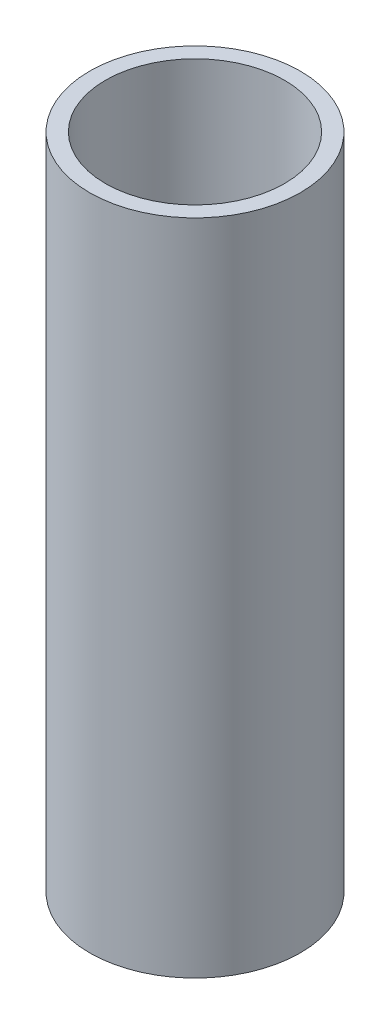
ISO-10303-21;
HEADER;
FILE_DESCRIPTION(('STEP AP214'),'2;1');
FILE_NAME('part.step','',(''),(''),'','','');
FILE_SCHEMA(('AUTOMOTIVE_DESIGN { 1 0 10303 214 1 1 1 1 }'));
ENDSEC;
DATA;
#1=APPLICATION_CONTEXT('core data for automotive mechanical design processes');
#2=APPLICATION_PROTOCOL_DEFINITION('international standard','automotive_design',2000,#1);
#3=PRODUCT_CONTEXT('',#1,'mechanical');
#4=PRODUCT('Part','Part','',(#3));
#5=PRODUCT_RELATED_PRODUCT_CATEGORY('part','',(#4));
#6=PRODUCT_DEFINITION_FORMATION('','',#4);
#7=PRODUCT_DEFINITION_CONTEXT('part definition',#1,'design');
#8=PRODUCT_DEFINITION('design','',#6,#7);
#9=PRODUCT_DEFINITION_SHAPE('','',#8);
#10=(LENGTH_UNIT() NAMED_UNIT(*) SI_UNIT(.MILLI.,.METRE.));
#11=(NAMED_UNIT(*) PLANE_ANGLE_UNIT() SI_UNIT($,.RADIAN.));
#12=(NAMED_UNIT(*) SI_UNIT($,.STERADIAN.) SOLID_ANGLE_UNIT());
#13=UNCERTAINTY_MEASURE_WITH_UNIT(LENGTH_MEASURE(1.E-05),#10,'distance_accuracy_value','');
#14=(GEOMETRIC_REPRESENTATION_CONTEXT(3) GLOBAL_UNCERTAINTY_ASSIGNED_CONTEXT((#13)) GLOBAL_UNIT_ASSIGNED_CONTEXT((#10,
#11,#12)) REPRESENTATION_CONTEXT('',''));
#15=CARTESIAN_POINT('',(0.,0.,0.));
#16=DIRECTION('',(0.,0.,1.));
#17=DIRECTION('',(1.,0.,0.));
#18=AXIS2_PLACEMENT_3D('',#15,#16,#17);
#19=CARTESIAN_POINT('',(0.,50.,0.));
#20=DIRECTION('',(0.,1.,0.));
#21=DIRECTION('',(0.,0.,1.));
#22=AXIS2_PLACEMENT_3D('',#19,#20,#21);
#23=PLANE('',#22);
#24=CARTESIAN_POINT('',(0.,50.,0.));
#25=DIRECTION('',(0.,1.,0.));
#26=DIRECTION('',(0.,0.,1.));
#27=AXIS2_PLACEMENT_3D('',#24,#25,#26);
#28=CIRCLE('',#27,8.);
#29=CARTESIAN_POINT('',(0.,50.,8.));
#30=VERTEX_POINT('',#29);
#31=EDGE_CURVE('E12',#30,#30,#28,.T.);
#32=ORIENTED_EDGE('',*,*,#31,.T.);
#33=EDGE_LOOP('',(#32));
#34=FACE_BOUND('',#33,.T.);
#35=CARTESIAN_POINT('',(0.,50.,0.));
#36=DIRECTION('',(0.,1.,0.));
#37=DIRECTION('',(0.,0.,1.));
#38=AXIS2_PLACEMENT_3D('',#35,#36,#37);
#39=CIRCLE('',#38,6.8);
#40=CARTESIAN_POINT('',(0.,50.,6.8));
#41=VERTEX_POINT('',#40);
#42=EDGE_CURVE('E63',#41,#41,#39,.T.);
#43=ORIENTED_EDGE('',*,*,#42,.F.);
#44=EDGE_LOOP('',(#43));
#45=FACE_BOUND('',#44,.T.);
#46=ADVANCED_FACE('F44',(#34,#45),#23,.T.);
#47=CARTESIAN_POINT('',(0.,0.,0.));
#48=DIRECTION('',(0.,1.,0.));
#49=DIRECTION('',(0.,0.,1.));
#50=AXIS2_PLACEMENT_3D('',#47,#48,#49);
#51=PLANE('',#50);
#52=CARTESIAN_POINT('',(0.,0.,0.));
#53=DIRECTION('',(0.,1.,0.));
#54=DIRECTION('',(0.,0.,1.));
#55=AXIS2_PLACEMENT_3D('',#52,#53,#54);
#56=CIRCLE('',#55,8.);
#57=CARTESIAN_POINT('',(0.,0.,8.));
#58=VERTEX_POINT('',#57);
#59=EDGE_CURVE('E58',#58,#58,#56,.T.);
#60=ORIENTED_EDGE('',*,*,#59,.F.);
#61=EDGE_LOOP('',(#60));
#62=FACE_BOUND('',#61,.T.);
#63=CARTESIAN_POINT('',(0.,0.,0.));
#64=DIRECTION('',(0.,1.,0.));
#65=DIRECTION('',(0.,0.,1.));
#66=AXIS2_PLACEMENT_3D('',#63,#64,#65);
#67=CIRCLE('',#66,6.8);
#68=CARTESIAN_POINT('',(0.,0.,6.8));
#69=VERTEX_POINT('',#68);
#70=EDGE_CURVE('E65',#69,#69,#67,.T.);
#71=ORIENTED_EDGE('',*,*,#70,.T.);
#72=EDGE_LOOP('',(#71));
#73=FACE_BOUND('',#72,.T.);
#74=ADVANCED_FACE('F86',(#62,#73),#51,.F.);
#75=CARTESIAN_POINT('',(0.,50.,0.));
#76=DIRECTION('',(0.,-1.,0.));
#77=DIRECTION('',(0.,0.,-1.));
#78=AXIS2_PLACEMENT_3D('',#75,#76,#77);
#79=CYLINDRICAL_SURFACE('',#78,8.);
#80=CARTESIAN_POINT('',(-8.,24.5,0.));
#81=CARTESIAN_POINT('',(-7.99999979228591,24.5000012344557,-0.0280558367091821));
#82=CARTESIAN_POINT('',(-7.99985083477361,24.5023693248675,-0.0561313179282487));
#83=CARTESIAN_POINT('',(-7.99927093430887,24.5117821169262,-0.111507052679596));
#84=CARTESIAN_POINT('',(-7.99883966315925,24.5188322617257,-0.138806365306198));
#85=CARTESIAN_POINT('',(-7.99774392375898,24.5374058754322,-0.191819627046947));
#86=CARTESIAN_POINT('',(-7.99707957853791,24.548926984653,-0.21753440416532));
#87=CARTESIAN_POINT('',(-7.99559241123927,24.5761116602213,-0.266658353952182));
#88=CARTESIAN_POINT('',(-7.9947696254675,24.5917742778702,-0.290068052963391));
#89=CARTESIAN_POINT('',(-7.99305668385845,24.626823076045,-0.33395911467123));
#90=CARTESIAN_POINT('',(-7.99216644050332,24.6462141456819,-0.354436570120391));
#91=CARTESIAN_POINT('',(-7.99041966644122,24.6881593337464,-0.391848452584882));
#92=CARTESIAN_POINT('',(-7.98956313714421,24.7107135842816,-0.408782731548836));
#93=CARTESIAN_POINT('',(-7.98797970915066,24.7583670205752,-0.438639593118486));
#94=CARTESIAN_POINT('',(-7.98725291552258,24.7834682434692,-0.451558930378413));
#95=CARTESIAN_POINT('',(-7.98601205213889,24.835488811184,-0.472998409001815));
#96=CARTESIAN_POINT('',(-7.98549798009556,24.8624081364485,-0.48151859767628));
#97=CARTESIAN_POINT('',(-7.98474136524808,24.9172631319654,-0.493907079357515));
#98=CARTESIAN_POINT('',(-7.98449846525661,24.9451974150888,-0.497781492271292));
#99=CARTESIAN_POINT('',(-7.98431051664854,25.0013208195642,-0.500787333987424));
#100=CARTESIAN_POINT('',(-7.98436546465861,25.0295099380264,-0.499918816506981));
#101=CARTESIAN_POINT('',(-7.98476668394761,25.0853011262049,-0.49346853042571));
#102=CARTESIAN_POINT('',(-7.9851125458736,25.1129039649659,-0.487893384610107));
#103=CARTESIAN_POINT('',(-7.98605597179483,25.1667812485114,-0.472198372131062));
#104=CARTESIAN_POINT('',(-7.9866535372982,25.1930556853356,-0.462078478236829));
#105=CARTESIAN_POINT('',(-7.98803349953298,25.2435516051369,-0.43757371806367));
#106=CARTESIAN_POINT('',(-7.98881602638135,25.2677716264962,-0.423185847514976));
#107=CARTESIAN_POINT('',(-7.99047759521135,25.3134552176401,-0.390555730417334));
#108=CARTESIAN_POINT('',(-7.99135663827798,25.3349187564317,-0.372313440536462));
#109=CARTESIAN_POINT('',(-7.99311399483716,25.3745186441193,-0.332455015749734));
#110=CARTESIAN_POINT('',(-7.99399230449394,25.3926492245922,-0.310833149168833));
#111=CARTESIAN_POINT('',(-7.99564776550351,25.4250240400367,-0.264849430306405));
#112=CARTESIAN_POINT('',(-7.99642491682094,25.4392682736505,-0.240487577067597));
#113=CARTESIAN_POINT('',(-7.99779054951097,25.4634655650452,-0.189711930689569));
#114=CARTESIAN_POINT('',(-7.99837902127751,25.4734184043515,-0.163298033161704));
#115=CARTESIAN_POINT('',(-7.99930085296737,25.4887465288667,-0.109169655355141));
#116=CARTESIAN_POINT('',(-7.99963421587005,25.4941218675352,-0.0814551902695094));
#117=CARTESIAN_POINT('',(-8.00000788106195,25.5001352568089,-0.0255624387495419));
#118=CARTESIAN_POINT('',(-8.0000486767247,25.5007812827734,0.00261498647919909));
#119=CARTESIAN_POINT('',(-7.9998339226558,25.4973385466835,0.0586778030242334));
#120=CARTESIAN_POINT('',(-7.99957837446632,25.4932498092687,0.0865631958594952));
#121=CARTESIAN_POINT('',(-7.99880001864981,25.4804602143183,0.141227915551527));
#122=CARTESIAN_POINT('',(-7.99827742306829,25.4717630158694,0.168008101776976));
#123=CARTESIAN_POINT('',(-7.99702376638161,25.4500070970273,0.219728740644334));
#124=CARTESIAN_POINT('',(-7.99629270340147,25.4369483374056,0.24466917673683));
#125=CARTESIAN_POINT('',(-7.99470302784673,25.4068196845835,0.292038869103172));
#126=CARTESIAN_POINT('',(-7.99384424645635,25.3897444648592,0.314464731786519));
#127=CARTESIAN_POINT('',(-7.99209634630093,25.3520753479282,0.356134526605823));
#128=CARTESIAN_POINT('',(-7.99120722723726,25.3314814160769,0.375378427409123));
#129=CARTESIAN_POINT('',(-7.9894974333173,25.2873250530204,0.410165050242898));
#130=CARTESIAN_POINT('',(-7.98867685517011,25.2637585413927,0.425702598194542));
#131=CARTESIAN_POINT('',(-7.98719822030013,25.214346495313,0.45260006824613));
#132=CARTESIAN_POINT('',(-7.98654016257513,25.1885009749162,0.463960016107838));
#133=CARTESIAN_POINT('',(-7.98546147670985,25.135283469682,0.482170859543531));
#134=CARTESIAN_POINT('',(-7.98504067712096,25.107912602855,0.48902501171311));
#135=CARTESIAN_POINT('',(-7.98448348616552,25.0524058317761,0.498040335423447));
#136=CARTESIAN_POINT('',(-7.98434709197624,25.0242699351198,0.500201553541822));
#137=CARTESIAN_POINT('',(-7.98437416152217,24.9680832291806,0.49976921012031));
#138=CARTESIAN_POINT('',(-7.98453711225631,24.9400323566944,0.497183783127632));
#139=CARTESIAN_POINT('',(-7.98514342216155,24.8847638469041,0.487348405135651));
#140=CARTESIAN_POINT('',(-7.98558678184072,24.8575462111097,0.480098445684941));
#141=CARTESIAN_POINT('',(-7.98670382148199,24.8047155515205,0.46114163156323));
#142=CARTESIAN_POINT('',(-7.98737749979011,24.779102516204,0.449434808898125));
#143=CARTESIAN_POINT('',(-7.98887924733515,24.7302044547774,0.421897705858959));
#144=CARTESIAN_POINT('',(-7.98970731257278,24.7069193683874,0.406067532293033));
#145=CARTESIAN_POINT('',(-7.99142617324983,24.6632969419064,0.370703029908459));
#146=CARTESIAN_POINT('',(-7.99231706680685,24.6429643712362,0.351162822925097));
#147=CARTESIAN_POINT('',(-7.994060360246,24.6058610547633,0.30894077452194));
#148=CARTESIAN_POINT('',(-7.99491275065667,24.5890911816402,0.286258165616383));
#149=CARTESIAN_POINT('',(-7.99648387242586,24.559576944852,0.238369362433013));
#150=CARTESIAN_POINT('',(-7.99720243711319,24.5468375873208,0.213160080631322));
#151=CARTESIAN_POINT('',(-7.9984226993582,24.5257878913396,0.160974253878685));
#152=CARTESIAN_POINT('',(-7.99892465077322,24.5174723657565,0.133999820525592));
#153=CARTESIAN_POINT('',(-7.9995235906633,24.5076676378197,0.0890503041140054));
#154=CARTESIAN_POINT('',(-7.99970145018531,24.5047959917511,0.0713657698559256));
#155=CARTESIAN_POINT('',(-7.99993972103123,24.5009617803817,0.035790155438182));
#156=CARTESIAN_POINT('',(-8.00000013251753,24.4999992124414,0.0178990755641165));
#157=CARTESIAN_POINT('',(-8.,24.5,0.));
#158=B_SPLINE_CURVE_WITH_KNOTS('',3,(#80,#81,#82,#83,#84,#85,#86,#87,#88,#89,#90,#91,#92,#93,
#94,#95,#96,#97,#98,#99,#100,#101,#102,#103,#104,#105,#106,#107,#108,#109,#110,#111,#112,#113,
#114,#115,#116,#117,#118,#119,#120,#121,#122,#123,#124,#125,#126,#127,#128,#129,#130,#131,#132,
#133,#134,#135,#136,#137,#138,#139,#140,#141,#142,#143,#144,#145,#146,#147,#148,#149,#150,#151,
#152,#153,#154,#155,#156,#157),.UNSPECIFIED.,.T.,.F.,(4,2,2,2,2,2,2,2,2,2,2,2,2,2,2,2,2,2,2,2,2,
2,2,2,2,2,2,2,2,2,2,2,2,2,2,2,2,2,4),(0.,0.0841021678684059,0.168302280814541,0.252458014920821,
0.336594488083847,0.420842051062136,0.505093133616078,0.589412141678689,0.673730242906974,
0.757937148964102,0.842143101317582,0.926230763005134,1.01031892852789,1.09446642554571,
1.17861486861186,1.26290760555944,1.34720037195678,1.43149742918579,1.51579350191214,
1.59994738766272,1.68410083548022,1.76818756593477,1.85227505269659,1.93647468912615,
2.02067515461697,2.10499248516164,2.18930929574278,2.27356509855734,2.35782006512482,
2.44193077478672,2.52604163684459,2.61015189489185,2.69425997442782,2.77850244367948,
2.86276552431575,2.94713285740405,3.03140104690859,3.08505666069928,3.13871220030719),.UNSPECIFIED.);
#159=CARTESIAN_POINT('',(-8.,24.5,0.));
#160=VERTEX_POINT('',#159);
#161=EDGE_CURVE('E68',#160,#160,#158,.T.);
#162=ORIENTED_EDGE('',*,*,#161,.T.);
#163=EDGE_LOOP('',(#162));
#164=FACE_BOUND('',#163,.T.);
#165=ORIENTED_EDGE('',*,*,#31,.F.);
#166=EDGE_LOOP('',(#165));
#167=FACE_BOUND('',#166,.T.);
#168=ORIENTED_EDGE('',*,*,#59,.T.);
#169=EDGE_LOOP('',(#168));
#170=FACE_BOUND('',#169,.T.);
#171=ADVANCED_FACE('F46',(#164,#167,#170),#79,.T.);
#172=CARTESIAN_POINT('',(0.,50.,0.));
#173=DIRECTION('',(0.,-1.,0.));
#174=DIRECTION('',(0.,0.,-1.));
#175=AXIS2_PLACEMENT_3D('',#172,#173,#174);
#176=CYLINDRICAL_SURFACE('',#175,6.8);
#177=CARTESIAN_POINT('',(-6.78159273327439,25.,-0.5));
#178=CARTESIAN_POINT('',(-6.78159297837757,25.0280444594005,-0.499998770231771));
#179=CARTESIAN_POINT('',(-6.78176856677654,25.056108286839,-0.497632591546758));
#180=CARTESIAN_POINT('',(-6.78245198649018,25.1114602513712,-0.488227838713538));
#181=CARTESIAN_POINT('',(-6.78296019944658,25.1387474598266,-0.481183897328643));
#182=CARTESIAN_POINT('',(-6.78425099555627,25.1917364427665,-0.462627731505158));
#183=CARTESIAN_POINT('',(-6.78503342856656,25.217439075812,-0.45111795186695));
#184=CARTESIAN_POINT('',(-6.78678431460584,25.2665411442032,-0.423960985491646));
#185=CARTESIAN_POINT('',(-6.78775272642474,25.2899410880559,-0.408314715049558));
#186=CARTESIAN_POINT('',(-6.78976866583827,25.3338274283134,-0.3732944202326));
#187=CARTESIAN_POINT('',(-6.79081633232312,25.3543085195989,-0.35391375506668));
#188=CARTESIAN_POINT('',(-6.79287145399055,25.3917302698817,-0.311988733735712));
#189=CARTESIAN_POINT('',(-6.79387890745549,25.4086707777776,-0.289444242616644));
#190=CARTESIAN_POINT('',(-6.79574135636166,25.4385475629814,-0.241800601139897));
#191=CARTESIAN_POINT('',(-6.79659617984393,25.4514793358105,-0.216698618778863));
#192=CARTESIAN_POINT('',(-6.79805556933641,25.4729427438242,-0.164672353745909));
#193=CARTESIAN_POINT('',(-6.79866013886455,25.4814744408629,-0.137748096696655));
#194=CARTESIAN_POINT('',(-6.79954993521933,25.4938804779224,-0.0828936605520093));
#195=CARTESIAN_POINT('',(-6.79983574266283,25.4977632867245,-0.0549654063471462));
#196=CARTESIAN_POINT('',(-6.80005777399104,25.5007874953176,0.00114779135175371));
#197=CARTESIAN_POINT('',(-6.79999400308205,25.4999289657218,0.0293327310167083));
#198=CARTESIAN_POINT('',(-6.79952454466821,25.4935018227874,0.0851018411694086));
#199=CARTESIAN_POINT('',(-6.79911951834028,25.4879423174393,0.11268706765116));
#200=CARTESIAN_POINT('',(-6.79801388751422,25.4722851850324,0.166531741703001));
#201=CARTESIAN_POINT('',(-6.79731328073735,25.4621875229872,0.192791179050378));
#202=CARTESIAN_POINT('',(-6.79569420149226,25.4377304792083,0.243267979866792));
#203=CARTESIAN_POINT('',(-6.79477551941267,25.4233669938601,0.267483348055106));
#204=CARTESIAN_POINT('',(-6.79282360632603,25.3907890116942,0.313162842512624));
#205=CARTESIAN_POINT('',(-6.79179037351871,25.3725744543494,0.334626925531545));
#206=CARTESIAN_POINT('',(-6.78972267451368,25.3327599851772,0.374247769142859));
#207=CARTESIAN_POINT('',(-6.78868821118392,25.3111521636063,0.392396582431197));
#208=CARTESIAN_POINT('',(-6.78673711523689,25.2651921713757,0.424810372711887));
#209=CARTESIAN_POINT('',(-6.78582048268846,25.2408399991124,0.439075347434897));
#210=CARTESIAN_POINT('',(-6.78420861400634,25.1900772609431,0.463316094783624));
#211=CARTESIAN_POINT('',(-6.78351339713152,25.1636665162296,0.47329149432556));
#212=CARTESIAN_POINT('',(-6.78242339907657,25.1095388232436,0.48866424399316));
#213=CARTESIAN_POINT('',(-6.7820286129932,25.0818218962966,0.494061668834618));
#214=CARTESIAN_POINT('',(-6.78158492474778,25.0259380514267,0.500115276160822));
#215=CARTESIAN_POINT('',(-6.78153521539852,24.9977723382166,0.50078252333151));
#216=CARTESIAN_POINT('',(-6.78178517593299,24.9417294257104,0.497385780829758));
#217=CARTESIAN_POINT('',(-6.78208484328886,24.9138522243283,0.493321825389031));
#218=CARTESIAN_POINT('',(-6.78299905331064,24.8592091900077,0.48058724596444));
#219=CARTESIAN_POINT('',(-6.78361324534929,24.8324421553153,0.471921751308709));
#220=CARTESIAN_POINT('',(-6.78508700233736,24.7807421126117,0.45023527947373));
#221=CARTESIAN_POINT('',(-6.78594657036216,24.7558091275922,0.4372142477048));
#222=CARTESIAN_POINT('',(-6.78781617977533,24.7084342092451,0.407158182314468));
#223=CARTESIAN_POINT('',(-6.78882649706358,24.68599697787,0.39011575480676));
#224=CARTESIAN_POINT('',(-6.79088281220847,24.6442979200478,0.352511390028049));
#225=CARTESIAN_POINT('',(-6.79192881054459,24.6250361362911,0.33194940544811));
#226=CARTESIAN_POINT('',(-6.79394100886642,24.5901971756913,0.287841888640238));
#227=CARTESIAN_POINT('',(-6.79490705113871,24.5746271732059,0.264290681464524));
#228=CARTESIAN_POINT('',(-6.79664822050773,24.5476629077774,0.214901657852393));
#229=CARTESIAN_POINT('',(-6.79742334914581,24.5362686111213,0.189063859879173));
#230=CARTESIAN_POINT('',(-6.79869461689291,24.5179916015319,0.135861139830761));
#231=CARTESIAN_POINT('',(-6.79919103352641,24.5111043995716,0.108497766791602));
#232=CARTESIAN_POINT('',(-6.7998500618275,24.5020224003259,0.0529992515100884));
#233=CARTESIAN_POINT('',(-6.80001267827625,24.4998275358303,0.0248641203277718));
#234=CARTESIAN_POINT('',(-6.79998579508498,24.5001932265867,-0.0313083985646325));
#235=CARTESIAN_POINT('',(-6.79979712504935,24.5027425778075,-0.0593458602961114));
#236=CARTESIAN_POINT('',(-6.79909051843197,24.5125010360774,-0.11459338198606));
#237=CARTESIAN_POINT('',(-6.79857258132922,24.5197101504996,-0.141803440635273));
#238=CARTESIAN_POINT('',(-6.79726560326606,24.5385807958466,-0.194624944412659));
#239=CARTESIAN_POINT('',(-6.79647657014824,24.5502421979712,-0.220236435760855));
#240=CARTESIAN_POINT('',(-6.79471583354579,24.5776850104177,-0.269139744831937));
#241=CARTESIAN_POINT('',(-6.79374413388129,24.5934663345815,-0.292431611050069));
#242=CARTESIAN_POINT('',(-6.79172451801548,24.6287428906352,-0.336091669932219));
#243=CARTESIAN_POINT('',(-6.7906764362776,24.648246346633,-0.35645320988031));
#244=CARTESIAN_POINT('',(-6.78862356662167,24.6904000655182,-0.393621074326442));
#245=CARTESIAN_POINT('',(-6.78761878930475,24.7130510932767,-0.410426532172275));
#246=CARTESIAN_POINT('',(-6.78576458384905,24.7608916905296,-0.440022648082052));
#247=CARTESIAN_POINT('',(-6.78491539882182,24.7860851388859,-0.452807045234631));
#248=CARTESIAN_POINT('',(-6.78347155374233,24.8382494600849,-0.473948321363632));
#249=CARTESIAN_POINT('',(-6.78287659844061,24.8652182289044,-0.482310338964573));
#250=CARTESIAN_POINT('',(-6.78216306649954,24.9102909507417,-0.492217618601713));
#251=CARTESIAN_POINT('',(-6.78195016075426,24.9281042469285,-0.495132185938415));
#252=CARTESIAN_POINT('',(-6.78166491548103,24.9639423597246,-0.499023770068941));
#253=CARTESIAN_POINT('',(-6.78159257567098,24.9819671759092,-0.500000790751351));
#254=CARTESIAN_POINT('',(-6.78159273327439,25.,-0.5));
#255=B_SPLINE_CURVE_WITH_KNOTS('',3,(#177,#178,#179,#180,#181,#182,#183,#184,#185,#186,#187,
#188,#189,#190,#191,#192,#193,#194,#195,#196,#197,#198,#199,#200,#201,#202,#203,#204,#205,#206,
#207,#208,#209,#210,#211,#212,#213,#214,#215,#216,#217,#218,#219,#220,#221,#222,#223,#224,#225,
#226,#227,#228,#229,#230,#231,#232,#233,#234,#235,#236,#237,#238,#239,#240,#241,#242,#243,#244,
#245,#246,#247,#248,#249,#250,#251,#252,#253,#254),.UNSPECIFIED.,.T.,.F.,(4,2,2,2,2,2,2,2,2,2,2,
2,2,2,2,2,2,2,2,2,2,2,2,2,2,2,2,2,2,2,2,2,2,2,2,2,2,2,4),(0.,0.0840675422441504,
0.168231710124484,0.252349867621573,0.336449407269913,0.420699902967302,0.504953993489757,
0.589302417128898,0.673649655006841,0.757843004383291,0.842035099863537,0.92606444861608,
1.01009444519174,1.09420553978808,1.17831795645114,1.26262943303783,1.34694095888792,
1.43125981621083,1.51557729736371,1.59969748038504,1.68381705477463,1.76784305744427,
1.85187011328475,1.93605288503214,2.02023678843051,2.10458297232423,2.18892847522232,
2.27318984236078,2.3574500025829,2.44151142487001,2.52557298016635,2.60963210383,
2.69368946974237,2.77793475820915,2.86220055449525,2.94659691296701,3.03089498965291,
3.08495123733822,3.13900737653453),.UNSPECIFIED.);
#256=CARTESIAN_POINT('',(-6.78159273327439,25.,-0.5));
#257=VERTEX_POINT('',#256);
#258=EDGE_CURVE('E49',#257,#257,#255,.T.);
#259=ORIENTED_EDGE('',*,*,#258,.F.);
#260=EDGE_LOOP('',(#259));
#261=FACE_BOUND('',#260,.T.);
#262=ORIENTED_EDGE('',*,*,#42,.T.);
#263=EDGE_LOOP('',(#262));
#264=FACE_BOUND('',#263,.T.);
#265=ORIENTED_EDGE('',*,*,#70,.F.);
#266=EDGE_LOOP('',(#265));
#267=FACE_BOUND('',#266,.T.);
#268=ADVANCED_FACE('F78',(#261,#264,#267),#176,.F.);
#269=CARTESIAN_POINT('',(-8.,25.,0.));
#270=DIRECTION('',(1.,0.,0.));
#271=DIRECTION('',(0.,0.,-1.));
#272=AXIS2_PLACEMENT_3D('',#269,#270,#271);
#273=CYLINDRICAL_SURFACE('',#272,0.5);
#274=ORIENTED_EDGE('',*,*,#258,.T.);
#275=EDGE_LOOP('',(#274));
#276=FACE_BOUND('',#275,.T.);
#277=ORIENTED_EDGE('',*,*,#161,.F.);
#278=EDGE_LOOP('',(#277));
#279=FACE_BOUND('',#278,.T.);
#280=ADVANCED_FACE('F75',(#276,#279),#273,.F.);
#281=CLOSED_SHELL('',(#46,#74,#171,#268,#280));
#282=MANIFOLD_SOLID_BREP('B2',#281);
#283=ADVANCED_BREP_SHAPE_REPRESENTATION('',(#18,#282),#14);
#284=SHAPE_DEFINITION_REPRESENTATION(#9,#283);
ENDSEC;
END-ISO-10303-21;
